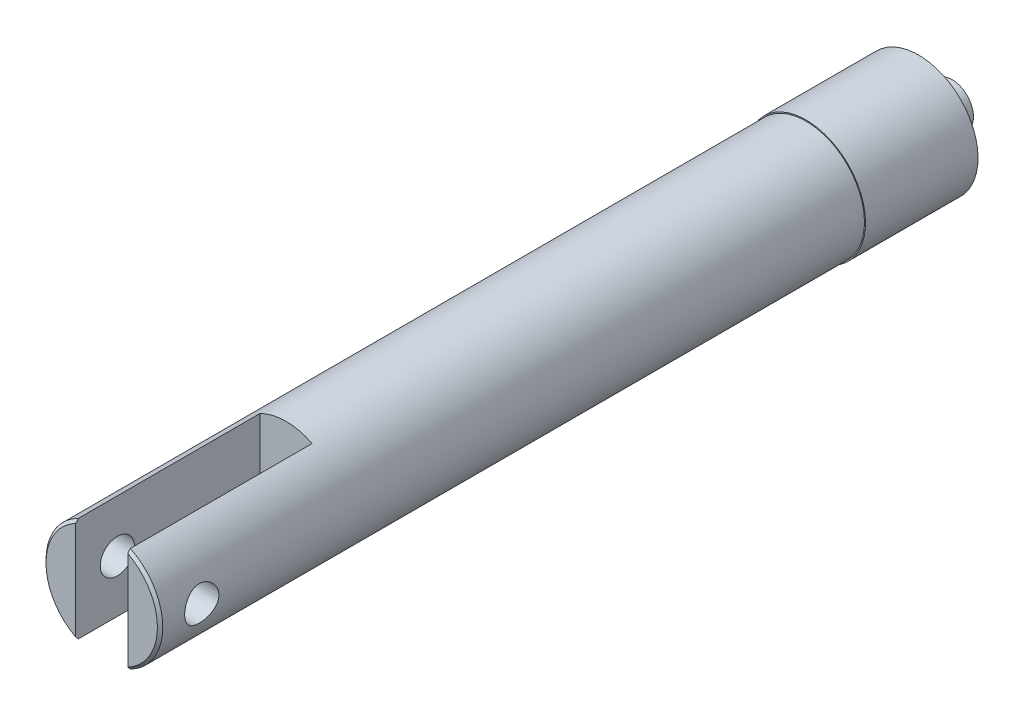
ISO-10303-21;
HEADER;
FILE_DESCRIPTION(('STEP AP214'),'2;1');
FILE_NAME('part.step','',(''),(''),'','','');
FILE_SCHEMA(('AUTOMOTIVE_DESIGN { 1 0 10303 214 1 1 1 1 }'));
ENDSEC;
DATA;
#1=APPLICATION_CONTEXT('core data for automotive mechanical design processes');
#2=APPLICATION_PROTOCOL_DEFINITION('international standard','automotive_design',2000,#1);
#3=PRODUCT_CONTEXT('',#1,'mechanical');
#4=PRODUCT('Part','Part','',(#3));
#5=PRODUCT_RELATED_PRODUCT_CATEGORY('part','',(#4));
#6=PRODUCT_DEFINITION_FORMATION('','',#4);
#7=PRODUCT_DEFINITION_CONTEXT('part definition',#1,'design');
#8=PRODUCT_DEFINITION('design','',#6,#7);
#9=PRODUCT_DEFINITION_SHAPE('','',#8);
#10=(LENGTH_UNIT() NAMED_UNIT(*) SI_UNIT(.MILLI.,.METRE.));
#11=(NAMED_UNIT(*) PLANE_ANGLE_UNIT() SI_UNIT($,.RADIAN.));
#12=(NAMED_UNIT(*) SI_UNIT($,.STERADIAN.) SOLID_ANGLE_UNIT());
#13=UNCERTAINTY_MEASURE_WITH_UNIT(LENGTH_MEASURE(1.E-05),#10,'distance_accuracy_value','');
#14=(GEOMETRIC_REPRESENTATION_CONTEXT(3) GLOBAL_UNCERTAINTY_ASSIGNED_CONTEXT((#13)) GLOBAL_UNIT_ASSIGNED_CONTEXT((#10,
#11,#12)) REPRESENTATION_CONTEXT('',''));
#15=CARTESIAN_POINT('',(0.,0.,0.));
#16=DIRECTION('',(0.,0.,1.));
#17=DIRECTION('',(1.,0.,0.));
#18=AXIS2_PLACEMENT_3D('',#15,#16,#17);
#19=CARTESIAN_POINT('',(0.,0.,29.3116));
#20=DIRECTION('',(0.,0.,-1.));
#21=DIRECTION('',(0.,1.,0.));
#22=AXIS2_PLACEMENT_3D('',#19,#20,#21);
#23=PLANE('',#22);
#24=DIRECTION('',(0.,-1.,0.));
#25=VECTOR('',#24,1.);
#26=CARTESIAN_POINT('',(-2.4765,5.5499,29.3116));
#27=LINE('',#26,#25);
#28=CARTESIAN_POINT('',(-2.4765,4.68118623427865,29.3116));
#29=VERTEX_POINT('',#28);
#30=CARTESIAN_POINT('',(-2.4765,-4.68118623427866,29.3116));
#31=VERTEX_POINT('',#30);
#32=EDGE_CURVE('E111',#29,#31,#27,.T.);
#33=ORIENTED_EDGE('',*,*,#32,.F.);
#34=CARTESIAN_POINT('',(0.,0.,29.3116));
#35=DIRECTION('',(0.,0.,1.));
#36=DIRECTION('',(0.,-1.,0.));
#37=AXIS2_PLACEMENT_3D('',#34,#35,#36);
#38=CIRCLE('',#37,5.2959);
#39=EDGE_CURVE('E200',#29,#31,#38,.T.);
#40=ORIENTED_EDGE('',*,*,#39,.T.);
#41=EDGE_LOOP('',(#33,#40));
#42=FACE_BOUND('',#41,.T.);
#43=ADVANCED_FACE('F35',(#42),#23,.F.);
#44=DIRECTION('',(0.,-1.,0.));
#45=VECTOR('',#44,1.);
#46=CARTESIAN_POINT('',(2.4765,5.5499,29.3116));
#47=LINE('',#46,#45);
#48=CARTESIAN_POINT('',(2.4765,4.68118623427865,29.3116));
#49=VERTEX_POINT('',#48);
#50=CARTESIAN_POINT('',(2.4765,-4.68118623427866,29.3116));
#51=VERTEX_POINT('',#50);
#52=EDGE_CURVE('E107',#49,#51,#47,.T.);
#53=ORIENTED_EDGE('',*,*,#52,.T.);
#54=EDGE_CURVE('E204',#51,#49,#38,.T.);
#55=ORIENTED_EDGE('',*,*,#54,.T.);
#56=EDGE_LOOP('',(#53,#55));
#57=FACE_BOUND('',#56,.T.);
#58=ADVANCED_FACE('F191',(#57),#23,.F.);
#59=CARTESIAN_POINT('',(0.,0.,29.0576));
#60=DIRECTION('',(0.,0.,-1.));
#61=DIRECTION('',(0.,1.,0.));
#62=AXIS2_PLACEMENT_3D('',#59,#60,#61);
#63=CONICAL_SURFACE('',#62,5.5499,0.785398163397448);
#64=CARTESIAN_POINT('',(-2.4765,11.9579738281488,22.3957765211174));
#65=CARTESIAN_POINT('',(-2.4765,11.6669516768995,22.6807379504089));
#66=CARTESIAN_POINT('',(-2.4765,11.3757282787579,22.9654943859405));
#67=CARTESIAN_POINT('',(-2.4765,10.7922540933097,23.5349364755889));
#68=CARTESIAN_POINT('',(-2.4765,10.5000024017493,23.8196212030231));
#69=CARTESIAN_POINT('',(-2.4765,9.90650352649077,24.3963861981994));
#70=CARTESIAN_POINT('',(-2.4765,9.60523692611629,24.6884464954769));
#71=CARTESIAN_POINT('',(-2.4765,9.00228537789054,25.2711102394173));
#72=CARTESIAN_POINT('',(-2.4765,8.70060200730528,25.5617153171939));
#73=CARTESIAN_POINT('',(-2.4765,8.11209652300594,26.1261907842555));
#74=CARTESIAN_POINT('',(-2.4765,7.82533866519259,26.400128122141));
#75=CARTESIAN_POINT('',(-2.4765,7.25026072461873,26.9464785770249));
#76=CARTESIAN_POINT('',(-2.4765,6.96194033428083,27.2188913707568));
#77=CARTESIAN_POINT('',(-2.4765,6.38119046188001,27.7633524723571));
#78=CARTESIAN_POINT('',(-2.4765,6.08874635093367,28.0353851921593));
#79=CARTESIAN_POINT('',(-2.4765,5.50099011407338,28.5758772463794));
#80=CARTESIAN_POINT('',(-2.4765,5.20568046970058,28.8443392653716));
#81=CARTESIAN_POINT('',(-2.4765,4.76315987763355,29.2393943792349));
#82=CARTESIAN_POINT('',(-2.4765,4.61778074117851,29.3680376470524));
#83=CARTESIAN_POINT('',(-2.4765,4.3255733961803,29.6236658089482));
#84=CARTESIAN_POINT('',(-2.4765,4.17874521488689,29.7506507341082));
#85=CARTESIAN_POINT('',(-2.4765,3.88275660050874,30.0028472478786));
#86=CARTESIAN_POINT('',(-2.4765,3.73359020362422,30.1280518538418));
#87=CARTESIAN_POINT('',(-2.4765,3.43283148005181,30.3754724529418));
#88=CARTESIAN_POINT('',(-2.4765,3.2812395877739,30.4976889715528));
#89=CARTESIAN_POINT('',(-2.4765,2.97686794303728,30.7363262900187));
#90=CARTESIAN_POINT('',(-2.4765,2.82413246110267,30.8528033423591));
#91=CARTESIAN_POINT('',(-2.4765,2.51420243017181,31.0800247091603));
#92=CARTESIAN_POINT('',(-2.4765,2.35700440076163,31.19076434756));
#93=CARTESIAN_POINT('',(-2.4765,2.11717726727405,31.3498965920427));
#94=CARTESIAN_POINT('',(-2.4765,2.03678129086018,31.401649953291));
#95=CARTESIAN_POINT('',(-2.4765,1.87426651639115,31.5023672426264));
#96=CARTESIAN_POINT('',(-2.4765,1.79214798128899,31.5513315922838));
#97=CARTESIAN_POINT('',(-2.4765,1.62603257042879,31.6456814294901));
#98=CARTESIAN_POINT('',(-2.4765,1.54203868904788,31.6910721623982));
#99=CARTESIAN_POINT('',(-2.4765,1.37180247112305,31.777391549933));
#100=CARTESIAN_POINT('',(-2.4765,1.28556115120854,31.8183221801186));
#101=CARTESIAN_POINT('',(-2.4765,1.16065385140699,31.8727172359465));
#102=CARTESIAN_POINT('',(-2.4765,1.12299179798917,31.8885003919733));
#103=CARTESIAN_POINT('',(-2.4765,1.04718754730382,31.9189227597439));
#104=CARTESIAN_POINT('',(-2.4765,1.00904514868885,31.9335614718907));
#105=CARTESIAN_POINT('',(-2.4765,0.932298661832612,31.9615677786896));
#106=CARTESIAN_POINT('',(-2.4765,0.893694617426716,31.9749354929667));
#107=CARTESIAN_POINT('',(-2.4765,0.816035573032734,32.0002757399932));
#108=CARTESIAN_POINT('',(-2.4765,0.776980600464427,32.0122483570889));
#109=CARTESIAN_POINT('',(-2.4765,0.66049053722621,32.0455027353079));
#110=CARTESIAN_POINT('',(-2.4765,0.582414930537375,32.0646084280714));
#111=CARTESIAN_POINT('',(-2.4765,0.42486511536397,32.0960051524822));
#112=CARTESIAN_POINT('',(-2.4765,0.345390467957431,32.1082940046992));
#113=CARTESIAN_POINT('',(-2.4765,0.184141528902734,32.125480118516));
#114=CARTESIAN_POINT('',(-2.4765,0.102351878225025,32.1302366239575));
#115=CARTESIAN_POINT('',(-2.4765,-0.0612701439947182,32.1315930066288));
#116=CARTESIAN_POINT('',(-2.4765,-0.143102494912401,32.1281953699553));
#117=CARTESIAN_POINT('',(-2.4765,-0.306261695222074,32.1134619809484));
#118=CARTESIAN_POINT('',(-2.4765,-0.387586560688786,32.1021046326579));
#119=CARTESIAN_POINT('',(-2.4765,-0.548892047976768,32.0721413387003));
#120=CARTESIAN_POINT('',(-2.4765,-0.628872168214943,32.0535327482943));
#121=CARTESIAN_POINT('',(-2.4765,-0.818603632855242,32.0013823902045));
#122=CARTESIAN_POINT('',(-2.4765,-0.927527399075539,31.9648448678084));
#123=CARTESIAN_POINT('',(-2.4765,-1.14169608127113,31.8822975735044));
#124=CARTESIAN_POINT('',(-2.4765,-1.24693873777164,31.8362820993481));
#125=CARTESIAN_POINT('',(-2.4765,-1.45461008685384,31.7368587442485));
#126=CARTESIAN_POINT('',(-2.4765,-1.55701805650607,31.6834080808766));
#127=CARTESIAN_POINT('',(-2.4765,-1.70834101067268,31.5992226294749));
#128=CARTESIAN_POINT('',(-2.4765,-1.75839420976593,31.5704965188583));
#129=CARTESIAN_POINT('',(-2.4765,-1.85780907482113,31.5118747467145));
#130=CARTESIAN_POINT('',(-2.4765,-1.90717077010375,31.4819791349806));
#131=CARTESIAN_POINT('',(-2.4765,-2.06969426299041,31.381242909254));
#132=CARTESIAN_POINT('',(-2.4765,-2.18149269372791,31.3082005127479));
#133=CARTESIAN_POINT('',(-2.4765,-2.40240413003915,31.1581463554024));
#134=CARTESIAN_POINT('',(-2.4765,-2.51151646114104,31.0811336123422));
#135=CARTESIAN_POINT('',(-2.4765,-2.72765615783911,30.9240717492863));
#136=CARTESIAN_POINT('',(-2.4765,-2.83468182747963,30.844020303506));
#137=CARTESIAN_POINT('',(-2.4765,-3.0469828645667,30.6816241610029));
#138=CARTESIAN_POINT('',(-2.4765,-3.15225811272229,30.5992793089995));
#139=CARTESIAN_POINT('',(-2.4765,-3.46652498439629,30.3491413614264));
#140=CARTESIAN_POINT('',(-2.4765,-3.67338304251804,30.1786712597172));
#141=CARTESIAN_POINT('',(-2.4765,-4.08315355653687,29.8332820215912));
#142=CARTESIAN_POINT('',(-2.4765,-4.28606776303578,29.6583649425436));
#143=CARTESIAN_POINT('',(-2.4765,-4.68981656840666,29.3048689419979));
#144=CARTESIAN_POINT('',(-2.4765,-4.89064250384476,29.1262801459341));
#145=CARTESIAN_POINT('',(-2.4765,-5.29032207131684,28.7668715648714));
#146=CARTESIAN_POINT('',(-2.4765,-5.48917548472361,28.5860515374466));
#147=CARTESIAN_POINT('',(-2.4765,-5.88506601239989,28.2230797461259));
#148=CARTESIAN_POINT('',(-2.4765,-6.0821055555888,28.0409306279334));
#149=CARTESIAN_POINT('',(-2.4765,-6.47503875401579,27.6753997260464));
#150=CARTESIAN_POINT('',(-2.4765,-6.67093240231825,27.4920179349055));
#151=CARTESIAN_POINT('',(-2.4765,-7.29802900851182,26.9021372423082));
#152=CARTESIAN_POINT('',(-2.4765,-7.72751652834494,26.4938156271734));
#153=CARTESIAN_POINT('',(-2.4765,-8.58407317998702,25.6741855738119));
#154=CARTESIAN_POINT('',(-2.4765,-9.01114086137836,25.2628756247995));
#155=CARTESIAN_POINT('',(-2.4765,-9.85895233955735,24.4428285151715));
#156=CARTESIAN_POINT('',(-2.4765,-10.2797149575069,24.0341108045201));
#157=CARTESIAN_POINT('',(-2.4765,-10.9098299234032,23.4202201761463));
#158=CARTESIAN_POINT('',(-2.4765,-11.1196367156543,23.2155131269927));
#159=CARTESIAN_POINT('',(-2.4765,-11.5389898687681,22.8058332649137));
#160=CARTESIAN_POINT('',(-2.4765,-11.7485362301486,22.6008604525185));
#161=CARTESIAN_POINT('',(-2.4765,-11.9579738281488,22.3957765211174));
#162=B_SPLINE_CURVE_WITH_KNOTS('',3,(#64,#65,#66,#67,#68,#69,#70,#71,#72,#73,#74,#75,#76,#77,
#78,#79,#80,#81,#82,#83,#84,#85,#86,#87,#88,#89,#90,#91,#92,#93,#94,#95,#96,#97,#98,#99,#100,
#101,#102,#103,#104,#105,#106,#107,#108,#109,#110,#111,#112,#113,#114,#115,#116,#117,#118,#119,
#120,#121,#122,#123,#124,#125,#126,#127,#128,#129,#130,#131,#132,#133,#134,#135,#136,#137,#138,
#139,#140,#141,#142,#143,#144,#145,#146,#147,#148,#149,#150,#151,#152,#153,#154,#155,#156,#157,
#158,#159,#160,#161),.UNSPECIFIED.,.F.,.F.,(4,2,2,2,2,2,2,2,2,2,2,2,2,2,2,2,2,2,2,2,2,2,2,2,2,2,
2,2,2,2,2,2,2,2,2,2,2,2,2,2,2,2,2,2,2,2,2,2,4),(0.,1.22191378573538,2.44588522501573,
3.7046715672028,4.96132197605525,6.15104296107095,7.34100732196848,8.53921226540252,
9.73645865747446,10.3188219836054,10.9011743789898,11.4853920232731,12.0695061792098,
12.6456678969772,13.2222920358278,13.5090897870932,13.7958440720429,14.0821692919997,
14.3683671669977,14.4908585076055,14.6134030255752,14.7359359983482,14.8584615590421,
15.0993147322068,15.3402448648668,15.5856262438034,15.8309328185054,16.0769075383521,
16.3229720564363,16.6670236189552,17.0112827820362,17.3576117554807,17.5307317508855,
17.7038443834218,18.1043455689445,18.5049463140632,18.905860113677,19.3068011244362,
20.1108286141899,20.9144906613942,21.7207079561374,22.5270136324517,23.332007317487,
24.1370058697903,25.9148096860511,27.6935853779615,29.4533602116242,30.3327432663626,
31.2121245697868),.UNSPECIFIED.);
#163=CARTESIAN_POINT('',(-2.4765,4.96672304039594,29.0576));
#164=VERTEX_POINT('',#163);
#165=EDGE_CURVE('E203',#164,#29,#162,.T.);
#166=ORIENTED_EDGE('',*,*,#165,.F.);
#167=CARTESIAN_POINT('',(0.,0.,29.0576));
#168=DIRECTION('',(0.,0.,1.));
#169=DIRECTION('',(0.,-1.,0.));
#170=AXIS2_PLACEMENT_3D('',#167,#168,#169);
#171=CIRCLE('',#170,5.5499);
#172=CARTESIAN_POINT('',(-2.4765,-4.96672304039595,29.0576));
#173=VERTEX_POINT('',#172);
#174=EDGE_CURVE('E208',#164,#173,#171,.T.);
#175=ORIENTED_EDGE('',*,*,#174,.T.);
#176=EDGE_CURVE('E57',#31,#173,#162,.T.);
#177=ORIENTED_EDGE('',*,*,#176,.F.);
#178=ORIENTED_EDGE('',*,*,#39,.F.);
#179=EDGE_LOOP('',(#166,#175,#177,#178));
#180=FACE_BOUND('',#179,.T.);
#181=ADVANCED_FACE('F131',(#180),#63,.T.);
#182=CARTESIAN_POINT('',(2.4765,-11.9579738281488,22.3957765211174));
#183=CARTESIAN_POINT('',(2.4765,-11.6669516768996,22.6807379504089));
#184=CARTESIAN_POINT('',(2.4765,-11.3757282787579,22.9654943859405));
#185=CARTESIAN_POINT('',(2.4765,-10.7922540933097,23.5349364755889));
#186=CARTESIAN_POINT('',(2.4765,-10.5000024017493,23.8196212030231));
#187=CARTESIAN_POINT('',(2.4765,-9.90650352649078,24.3963861981994));
#188=CARTESIAN_POINT('',(2.4765,-9.60523692611631,24.6884464954768));
#189=CARTESIAN_POINT('',(2.4765,-9.00228537789057,25.2711102394173));
#190=CARTESIAN_POINT('',(2.4765,-8.7006020073053,25.5617153171938));
#191=CARTESIAN_POINT('',(2.4765,-8.11209652300596,26.1261907842555));
#192=CARTESIAN_POINT('',(2.4765,-7.82533866519262,26.400128122141));
#193=CARTESIAN_POINT('',(2.4765,-7.25026072461875,26.9464785770249));
#194=CARTESIAN_POINT('',(2.4765,-6.96194033428086,27.2188913707568));
#195=CARTESIAN_POINT('',(2.4765,-6.38119046188003,27.7633524723571));
#196=CARTESIAN_POINT('',(2.4765,-6.08874635093369,28.0353851921593));
#197=CARTESIAN_POINT('',(2.4765,-5.5009901140734,28.5758772463793));
#198=CARTESIAN_POINT('',(2.4765,-5.20568046970059,28.8443392653716));
#199=CARTESIAN_POINT('',(2.4765,-4.76315987763356,29.2393943792349));
#200=CARTESIAN_POINT('',(2.4765,-4.61778074117853,29.3680376470524));
#201=CARTESIAN_POINT('',(2.4765,-4.32557339618031,29.6236658089482));
#202=CARTESIAN_POINT('',(2.4765,-4.17874521488691,29.7506507341082));
#203=CARTESIAN_POINT('',(2.4765,-3.88275660050875,30.0028472478786));
#204=CARTESIAN_POINT('',(2.4765,-3.73359020362423,30.1280518538418));
#205=CARTESIAN_POINT('',(2.4765,-3.43283148005182,30.3754724529418));
#206=CARTESIAN_POINT('',(2.4765,-3.28123958777391,30.4976889715528));
#207=CARTESIAN_POINT('',(2.4765,-2.97686794303729,30.7363262900187));
#208=CARTESIAN_POINT('',(2.4765,-2.82413246110268,30.8528033423591));
#209=CARTESIAN_POINT('',(2.4765,-2.51420243017182,31.0800247091603));
#210=CARTESIAN_POINT('',(2.4765,-2.35700440076164,31.19076434756));
#211=CARTESIAN_POINT('',(2.4765,-2.11717726727406,31.3498965920427));
#212=CARTESIAN_POINT('',(2.4765,-2.03678129086019,31.401649953291));
#213=CARTESIAN_POINT('',(2.4765,-1.87426651639116,31.5023672426264));
#214=CARTESIAN_POINT('',(2.4765,-1.792147981289,31.5513315922838));
#215=CARTESIAN_POINT('',(2.4765,-1.6260325704288,31.6456814294901));
#216=CARTESIAN_POINT('',(2.4765,-1.54203868904788,31.6910721623982));
#217=CARTESIAN_POINT('',(2.4765,-1.37180247112306,31.777391549933));
#218=CARTESIAN_POINT('',(2.4765,-1.28556115120854,31.8183221801186));
#219=CARTESIAN_POINT('',(2.4765,-1.160653851407,31.8727172359465));
#220=CARTESIAN_POINT('',(2.4765,-1.12299179798918,31.8885003919733));
#221=CARTESIAN_POINT('',(2.4765,-1.04718754730383,31.9189227597439));
#222=CARTESIAN_POINT('',(2.4765,-1.00904514868886,31.9335614718907));
#223=CARTESIAN_POINT('',(2.4765,-0.93229866183262,31.9615677786896));
#224=CARTESIAN_POINT('',(2.4765,-0.893694617426723,31.9749354929667));
#225=CARTESIAN_POINT('',(2.4765,-0.816035573032741,32.0002757399932));
#226=CARTESIAN_POINT('',(2.4765,-0.776980600464434,32.0122483570889));
#227=CARTESIAN_POINT('',(2.4765,-0.660490537226217,32.0455027353079));
#228=CARTESIAN_POINT('',(2.4765,-0.582414930537382,32.0646084280714));
#229=CARTESIAN_POINT('',(2.4765,-0.424865115363978,32.0960051524822));
#230=CARTESIAN_POINT('',(2.4765,-0.345390467957438,32.1082940046992));
#231=CARTESIAN_POINT('',(2.4765,-0.184141528902741,32.125480118516));
#232=CARTESIAN_POINT('',(2.4765,-0.102351878225032,32.1302366239575));
#233=CARTESIAN_POINT('',(2.4765,0.0612701439947103,32.1315930066288));
#234=CARTESIAN_POINT('',(2.4765,0.143102494912393,32.1281953699552));
#235=CARTESIAN_POINT('',(2.4765,0.306261695222067,32.1134619809484));
#236=CARTESIAN_POINT('',(2.4765,0.387586560688778,32.1021046326579));
#237=CARTESIAN_POINT('',(2.4765,0.54889204797676,32.0721413387003));
#238=CARTESIAN_POINT('',(2.4765,0.628872168214936,32.0535327482943));
#239=CARTESIAN_POINT('',(2.4765,0.818603632855233,32.0013823902045));
#240=CARTESIAN_POINT('',(2.4765,0.927527399075527,31.9648448678084));
#241=CARTESIAN_POINT('',(2.4765,1.14169608127112,31.8822975735044));
#242=CARTESIAN_POINT('',(2.4765,1.24693873777163,31.8362820993481));
#243=CARTESIAN_POINT('',(2.4765,1.45461008685383,31.7368587442485));
#244=CARTESIAN_POINT('',(2.4765,1.55701805650607,31.6834080808766));
#245=CARTESIAN_POINT('',(2.4765,1.70834101067267,31.5992226294749));
#246=CARTESIAN_POINT('',(2.4765,1.75839420976592,31.5704965188583));
#247=CARTESIAN_POINT('',(2.4765,1.85780907482112,31.5118747467145));
#248=CARTESIAN_POINT('',(2.4765,1.90717077010374,31.4819791349806));
#249=CARTESIAN_POINT('',(2.4765,2.06969426299041,31.381242909254));
#250=CARTESIAN_POINT('',(2.4765,2.18149269372791,31.3082005127479));
#251=CARTESIAN_POINT('',(2.4765,2.40240413003915,31.1581463554024));
#252=CARTESIAN_POINT('',(2.4765,2.51151646114103,31.0811336123422));
#253=CARTESIAN_POINT('',(2.4765,2.72765615783911,30.9240717492863));
#254=CARTESIAN_POINT('',(2.4765,2.83468182747963,30.844020303506));
#255=CARTESIAN_POINT('',(2.4765,3.0469828645667,30.6816241610029));
#256=CARTESIAN_POINT('',(2.4765,3.15225811272228,30.5992793089995));
#257=CARTESIAN_POINT('',(2.4765,3.46652498439629,30.3491413614264));
#258=CARTESIAN_POINT('',(2.4765,3.67338304251804,30.1786712597172));
#259=CARTESIAN_POINT('',(2.4765,4.08315355653687,29.8332820215912));
#260=CARTESIAN_POINT('',(2.4765,4.28606776303578,29.6583649425436));
#261=CARTESIAN_POINT('',(2.4765,4.68981656840666,29.3048689419979));
#262=CARTESIAN_POINT('',(2.4765,4.89064250384476,29.1262801459341));
#263=CARTESIAN_POINT('',(2.4765,5.29032207131684,28.7668715648714));
#264=CARTESIAN_POINT('',(2.4765,5.48917548472361,28.5860515374466));
#265=CARTESIAN_POINT('',(2.4765,5.8850660123999,28.2230797461259));
#266=CARTESIAN_POINT('',(2.4765,6.0821055555888,28.0409306279334));
#267=CARTESIAN_POINT('',(2.4765,6.4750387540158,27.6753997260464));
#268=CARTESIAN_POINT('',(2.4765,6.67093240231825,27.4920179349055));
#269=CARTESIAN_POINT('',(2.4765,7.29802900851182,26.9021372423082));
#270=CARTESIAN_POINT('',(2.4765,7.72751652834495,26.4938156271734));
#271=CARTESIAN_POINT('',(2.4765,8.58407317998702,25.6741855738118));
#272=CARTESIAN_POINT('',(2.4765,9.01114086137836,25.2628756247995));
#273=CARTESIAN_POINT('',(2.4765,9.85895233955735,24.4428285151715));
#274=CARTESIAN_POINT('',(2.4765,10.2797149575069,24.0341108045201));
#275=CARTESIAN_POINT('',(2.4765,10.9098299234032,23.4202201761463));
#276=CARTESIAN_POINT('',(2.4765,11.1196367156543,23.2155131269927));
#277=CARTESIAN_POINT('',(2.4765,11.5389898687681,22.8058332649137));
#278=CARTESIAN_POINT('',(2.4765,11.7485362301486,22.6008604525185));
#279=CARTESIAN_POINT('',(2.4765,11.9579738281488,22.3957765211174));
#280=B_SPLINE_CURVE_WITH_KNOTS('',3,(#182,#183,#184,#185,#186,#187,#188,#189,#190,#191,#192,
#193,#194,#195,#196,#197,#198,#199,#200,#201,#202,#203,#204,#205,#206,#207,#208,#209,#210,#211,
#212,#213,#214,#215,#216,#217,#218,#219,#220,#221,#222,#223,#224,#225,#226,#227,#228,#229,#230,
#231,#232,#233,#234,#235,#236,#237,#238,#239,#240,#241,#242,#243,#244,#245,#246,#247,#248,#249,
#250,#251,#252,#253,#254,#255,#256,#257,#258,#259,#260,#261,#262,#263,#264,#265,#266,#267,#268,
#269,#270,#271,#272,#273,#274,#275,#276,#277,#278,#279),.UNSPECIFIED.,.F.,.F.,(4,2,2,2,2,2,2,2,
2,2,2,2,2,2,2,2,2,2,2,2,2,2,2,2,2,2,2,2,2,2,2,2,2,2,2,2,2,2,2,2,2,2,2,2,2,2,2,2,4),(0.,
1.22191378573537,2.44588522501572,3.70467156720278,4.96132197605523,6.15104296107092,
7.34100732196846,8.5392122654025,9.73645865747445,10.3188219836054,10.9011743789898,
11.4853920232731,12.0695061792098,12.6456678969772,13.2222920358278,13.5090897870932,
13.7958440720429,14.0821692919997,14.3683671669977,14.4908585076055,14.6134030255752,
14.7359359983483,14.8584615590421,15.0993147322068,15.3402448648668,15.5856262438034,
15.8309328185054,16.0769075383521,16.3229720564363,16.6670236189552,17.0112827820362,
17.3576117554807,17.5307317508855,17.7038443834218,18.1043455689445,18.5049463140632,
18.905860113677,19.3068011244362,20.1108286141899,20.9144906613942,21.7207079561375,
22.5270136324518,23.332007317487,24.1370058697903,25.9148096860511,27.6935853779615,
29.4533602116242,30.3327432663627,31.2121245697868),.UNSPECIFIED.);
#281=CARTESIAN_POINT('',(2.4765,-4.96672304039595,29.0576));
#282=VERTEX_POINT('',#281);
#283=EDGE_CURVE('E124',#282,#51,#280,.T.);
#284=ORIENTED_EDGE('',*,*,#283,.F.);
#285=CARTESIAN_POINT('',(2.4765,4.96672304039594,29.0576));
#286=VERTEX_POINT('',#285);
#287=EDGE_CURVE('E205',#282,#286,#171,.T.);
#288=ORIENTED_EDGE('',*,*,#287,.T.);
#289=EDGE_CURVE('E105',#49,#286,#280,.T.);
#290=ORIENTED_EDGE('',*,*,#289,.F.);
#291=ORIENTED_EDGE('',*,*,#54,.F.);
#292=EDGE_LOOP('',(#284,#288,#290,#291));
#293=FACE_BOUND('',#292,.T.);
#294=ADVANCED_FACE('F165',(#293),#63,.T.);
#295=CARTESIAN_POINT('',(0.,0.,29.3116));
#296=DIRECTION('',(0.,0.,1.));
#297=DIRECTION('',(0.,-1.,0.));
#298=AXIS2_PLACEMENT_3D('',#295,#296,#297);
#299=CYLINDRICAL_SURFACE('',#298,5.54989999999999);
#300=CARTESIAN_POINT('',(-5.54989999999999,0.,23.7236));
#301=CARTESIAN_POINT('',(-5.54989907724446,0.0892755035356934,23.7236013366109));
#302=CARTESIAN_POINT('',(-5.54772514584038,0.178564598579979,23.7309787664117));
#303=CARTESIAN_POINT('',(-5.53926498675739,0.354548754643266,23.7602275075715));
#304=CARTESIAN_POINT('',(-5.53297736763345,0.44124292755625,23.7821037231427));
#305=CARTESIAN_POINT('',(-5.51697990977184,0.609473116793908,23.8395614415831));
#306=CARTESIAN_POINT('',(-5.50727498299406,0.691016339606443,23.8751232798328));
#307=CARTESIAN_POINT('',(-5.4854553353211,0.846982422213485,23.9588638222887));
#308=CARTESIAN_POINT('',(-5.47334032780879,0.921404433562518,24.0070440273409));
#309=CARTESIAN_POINT('',(-5.447623738627,1.06306206351374,24.1160503739585));
#310=CARTESIAN_POINT('',(-5.43399277761792,1.13007413479286,24.1771600796466));
#311=CARTESIAN_POINT('',(-5.40695871720613,1.25306050894608,24.3096860072907));
#312=CARTESIAN_POINT('',(-5.39355565431872,1.30903305794539,24.3811038638104));
#313=CARTESIAN_POINT('',(-5.36818646723952,1.4095084802972,24.5340864090737));
#314=CARTESIAN_POINT('',(-5.35625698087354,1.4537419990312,24.6158346474855));
#315=CARTESIAN_POINT('',(-5.3356231908575,1.52774394633379,24.7860149293263));
#316=CARTESIAN_POINT('',(-5.3269181535705,1.55751566577768,24.8744454468623));
#317=CARTESIAN_POINT('',(-5.31402441443637,1.60094937376303,25.0529770555034));
#318=CARTESIAN_POINT('',(-5.30972084078135,1.61502202923219,25.1429697242109));
#319=CARTESIAN_POINT('',(-5.30577522506576,1.62794009113206,25.3241336530228));
#320=CARTESIAN_POINT('',(-5.30613211258399,1.62678899417463,25.4153046376842));
#321=CARTESIAN_POINT('',(-5.31136506183246,1.60961554928479,25.5929283003343));
#322=CARTESIAN_POINT('',(-5.31608598981721,1.59410367279516,25.6794356534326));
#323=CARTESIAN_POINT('',(-5.32926468904175,1.54947215430466,25.8485621163824));
#324=CARTESIAN_POINT('',(-5.33772281350872,1.52035122600719,25.9311808578784));
#325=CARTESIAN_POINT('',(-5.35754944323353,1.44894354386055,26.0914515145175));
#326=CARTESIAN_POINT('',(-5.36895484387434,1.40648829613039,26.1690235994491));
#327=CARTESIAN_POINT('',(-5.39337272942498,1.30973430955867,26.3161153848713));
#328=CARTESIAN_POINT('',(-5.40638558770937,1.25543281686108,26.3856332072521));
#329=CARTESIAN_POINT('',(-5.43318503855367,1.13397587214191,26.5175433329357));
#330=CARTESIAN_POINT('',(-5.44698183679616,1.0663956318097,26.5795430829118));
#331=CARTESIAN_POINT('',(-5.47333553243088,0.921625644531362,26.6914184508191));
#332=CARTESIAN_POINT('',(-5.48589235885702,0.844435348153167,26.7412933750606));
#333=CARTESIAN_POINT('',(-5.50845703510734,0.681946511936177,26.8277267908149));
#334=CARTESIAN_POINT('',(-5.51844878775259,0.596601168856786,26.8642017779052));
#335=CARTESIAN_POINT('',(-5.53464153738588,0.420627572777451,26.9221663453222));
#336=CARTESIAN_POINT('',(-5.54084354037326,0.330000728769289,26.9436599027234));
#337=CARTESIAN_POINT('',(-5.54860041170824,0.14937671449739,26.9704062472826));
#338=CARTESIAN_POINT('',(-5.55030755347607,0.0594647975219507,26.9761914120506));
#339=CARTESIAN_POINT('',(-5.54932710557458,-0.120049253866679,26.9728440587747));
#340=CARTESIAN_POINT('',(-5.54664007260265,-0.209651426080247,26.9637134304106));
#341=CARTESIAN_POINT('',(-5.5372726201359,-0.384017379998919,26.9312256834306));
#342=CARTESIAN_POINT('',(-5.53067869809617,-0.46884362206552,26.9081765115788));
#343=CARTESIAN_POINT('',(-5.51425674885354,-0.633409078191009,26.84887358698));
#344=CARTESIAN_POINT('',(-5.50442833990401,-0.713147690461333,26.8126182755396));
#345=CARTESIAN_POINT('',(-5.48228553814936,-0.86725777205337,26.7270180513095));
#346=CARTESIAN_POINT('',(-5.46992038277833,-0.941468972634517,26.6773980779087));
#347=CARTESIAN_POINT('',(-5.44412636779364,-1.08069411948732,26.5668137514691));
#348=CARTESIAN_POINT('',(-5.43069725429657,-1.14570586019558,26.505846686058));
#349=CARTESIAN_POINT('',(-5.40370955417761,-1.2670092130063,26.371800125755));
#350=CARTESIAN_POINT('',(-5.39016248555801,-1.322922586817,26.2983753099357));
#351=CARTESIAN_POINT('',(-5.36496855466263,-1.42165686173055,26.1428916071624));
#352=CARTESIAN_POINT('',(-5.3533216337151,-1.46447816711899,26.060832986927));
#353=CARTESIAN_POINT('',(-5.33338212831179,-1.53550894747979,25.8907146501301));
#354=CARTESIAN_POINT('',(-5.32507279024849,-1.56379160744794,25.8026875666497));
#355=CARTESIAN_POINT('',(-5.31278245616318,-1.60505609960617,25.6228339179118));
#356=CARTESIAN_POINT('',(-5.308800064152,-1.61804286677638,25.5310085880017));
#357=CARTESIAN_POINT('',(-5.30574755389828,-1.62802231224556,25.3500811638763));
#358=CARTESIAN_POINT('',(-5.30648868365528,-1.62562952447749,25.2610156934586));
#359=CARTESIAN_POINT('',(-5.31234851911418,-1.6063755096074,25.0846168197822));
#360=CARTESIAN_POINT('',(-5.31746706450858,-1.58951481234178,24.9972833532147));
#361=CARTESIAN_POINT('',(-5.33138140938686,-1.54219182804677,24.8277805846974));
#362=CARTESIAN_POINT('',(-5.3401350972468,-1.51188504194761,24.7455641592093));
#363=CARTESIAN_POINT('',(-5.36032744257694,-1.43865075303401,24.5873176373947));
#364=CARTESIAN_POINT('',(-5.37176659486979,-1.39572092393393,24.5112886846505));
#365=CARTESIAN_POINT('',(-5.39653949353948,-1.29670299971405,24.3647051995735));
#366=CARTESIAN_POINT('',(-5.40992543962596,-1.24020786458484,24.2944344404681));
#367=CARTESIAN_POINT('',(-5.436822312107,-1.11640479915404,24.1641713291863));
#368=CARTESIAN_POINT('',(-5.45033326958017,-1.04909410804624,24.1041816094757));
#369=CARTESIAN_POINT('',(-5.47640171115957,-0.903346998093417,23.9945489602031));
#370=CARTESIAN_POINT('',(-5.48892290208423,-0.82465616083069,23.9452347679671));
#371=CARTESIAN_POINT('',(-5.51117470083009,-0.659733541919419,23.8606077721015));
#372=CARTESIAN_POINT('',(-5.52090672456865,-0.573505615581995,23.8252878607966));
#373=CARTESIAN_POINT('',(-5.53554159653088,-0.406607676404475,23.7731441030581));
#374=CARTESIAN_POINT('',(-5.54088270864287,-0.326505770576913,23.7546137388842));
#375=CARTESIAN_POINT('',(-5.5480620726446,-0.16427287480861,23.7298419924793));
#376=CARTESIAN_POINT('',(-5.54990084902529,-0.0821421905531775,23.7235987701873));
#377=CARTESIAN_POINT('',(-5.54989999999999,0.,23.7236));
#378=B_SPLINE_CURVE_WITH_KNOTS('',3,(#300,#301,#302,#303,#304,#305,#306,#307,#308,#309,#310,
#311,#312,#313,#314,#315,#316,#317,#318,#319,#320,#321,#322,#323,#324,#325,#326,#327,#328,#329,
#330,#331,#332,#333,#334,#335,#336,#337,#338,#339,#340,#341,#342,#343,#344,#345,#346,#347,#348,
#349,#350,#351,#352,#353,#354,#355,#356,#357,#358,#359,#360,#361,#362,#363,#364,#365,#366,#367,
#368,#369,#370,#371,#372,#373,#374,#375,#376,#377),.UNSPECIFIED.,.T.,.F.,(4,2,2,2,2,2,2,2,2,2,2,
2,2,2,2,2,2,2,2,2,2,2,2,2,2,2,2,2,2,2,2,2,2,2,2,2,2,2,4),(0.,0.267524894024951,
0.535140324521176,0.802372650462127,1.06963677583499,1.34351804773345,1.61744279680396,
1.89719534749838,2.1768842088467,2.44907144661051,2.72119616913071,2.98400461004568,
3.24683789604154,3.51313589642218,3.77949586827923,4.05643251894111,4.33338501007359,
4.61203523081333,4.89061145092611,5.15962107066189,5.42859661224727,5.69182861968128,
5.9550917059207,6.22425291871496,6.4934785537626,6.77199275109868,7.05049834699399,
7.32758791720903,7.60458806430623,7.8705906221093,8.13658343891815,8.39957719472723,
8.66261944775291,8.93484460609823,9.20713936404279,9.48689894034203,9.76651624444682,
10.0127021697455,10.2588512246644),.UNSPECIFIED.);
#379=CARTESIAN_POINT('',(-5.54989999999999,0.,23.7236));
#380=VERTEX_POINT('',#379);
#381=EDGE_CURVE('E113',#380,#380,#378,.T.);
#382=ORIENTED_EDGE('',*,*,#381,.T.);
#383=EDGE_LOOP('',(#382));
#384=FACE_BOUND('',#383,.T.);
#385=CARTESIAN_POINT('',(5.54989999999999,0.,23.7236));
#386=CARTESIAN_POINT('',(5.54989907724446,-0.0892755035356933,23.7236013366109));
#387=CARTESIAN_POINT('',(5.54772514584038,-0.178564598579979,23.7309787664117));
#388=CARTESIAN_POINT('',(5.53926498675739,-0.354548754643266,23.7602275075715));
#389=CARTESIAN_POINT('',(5.53297736763345,-0.44124292755625,23.7821037231427));
#390=CARTESIAN_POINT('',(5.51697990977184,-0.609473116793908,23.8395614415831));
#391=CARTESIAN_POINT('',(5.50727498299406,-0.691016339606443,23.8751232798328));
#392=CARTESIAN_POINT('',(5.4854553353211,-0.846982422213485,23.9588638222887));
#393=CARTESIAN_POINT('',(5.4733403278088,-0.921404433562518,24.0070440273409));
#394=CARTESIAN_POINT('',(5.447623738627,-1.06306206351374,24.1160503739585));
#395=CARTESIAN_POINT('',(5.43399277761792,-1.13007413479286,24.1771600796466));
#396=CARTESIAN_POINT('',(5.40695871720613,-1.25306050894608,24.3096860072907));
#397=CARTESIAN_POINT('',(5.39355565431872,-1.30903305794539,24.3811038638104));
#398=CARTESIAN_POINT('',(5.36818646723952,-1.4095084802972,24.5340864090737));
#399=CARTESIAN_POINT('',(5.35625698087354,-1.4537419990312,24.6158346474855));
#400=CARTESIAN_POINT('',(5.3356231908575,-1.52774394633378,24.7860149293263));
#401=CARTESIAN_POINT('',(5.32691815357051,-1.55751566577768,24.8744454468623));
#402=CARTESIAN_POINT('',(5.31402441443637,-1.60094937376303,25.0529770555034));
#403=CARTESIAN_POINT('',(5.30972084078135,-1.61502202923219,25.1429697242109));
#404=CARTESIAN_POINT('',(5.30577522506576,-1.62794009113206,25.3241336530228));
#405=CARTESIAN_POINT('',(5.30613211258399,-1.62678899417463,25.4153046376842));
#406=CARTESIAN_POINT('',(5.31136506183246,-1.60961554928479,25.5929283003343));
#407=CARTESIAN_POINT('',(5.31608598981722,-1.59410367279516,25.6794356534326));
#408=CARTESIAN_POINT('',(5.32926468904176,-1.54947215430466,25.8485621163824));
#409=CARTESIAN_POINT('',(5.33772281350872,-1.52035122600719,25.9311808578784));
#410=CARTESIAN_POINT('',(5.35754944323354,-1.44894354386055,26.0914515145175));
#411=CARTESIAN_POINT('',(5.36895484387435,-1.40648829613039,26.1690235994491));
#412=CARTESIAN_POINT('',(5.39337272942498,-1.30973430955867,26.3161153848713));
#413=CARTESIAN_POINT('',(5.40638558770938,-1.25543281686108,26.3856332072521));
#414=CARTESIAN_POINT('',(5.43318503855367,-1.13397587214191,26.5175433329357));
#415=CARTESIAN_POINT('',(5.44698183679616,-1.0663956318097,26.5795430829118));
#416=CARTESIAN_POINT('',(5.47333553243088,-0.921625644531362,26.6914184508191));
#417=CARTESIAN_POINT('',(5.48589235885702,-0.844435348153167,26.7412933750606));
#418=CARTESIAN_POINT('',(5.50845703510735,-0.681946511936178,26.8277267908149));
#419=CARTESIAN_POINT('',(5.51844878775259,-0.596601168856787,26.8642017779052));
#420=CARTESIAN_POINT('',(5.53464153738588,-0.420627572777452,26.9221663453222));
#421=CARTESIAN_POINT('',(5.54084354037326,-0.33000072876929,26.9436599027234));
#422=CARTESIAN_POINT('',(5.54860041170824,-0.149376714497389,26.9704062472826));
#423=CARTESIAN_POINT('',(5.55030755347607,-0.05946479752195,26.9761914120506));
#424=CARTESIAN_POINT('',(5.54932710557458,0.12004925386668,26.9728440587747));
#425=CARTESIAN_POINT('',(5.54664007260265,0.209651426080247,26.9637134304106));
#426=CARTESIAN_POINT('',(5.5372726201359,0.384017379998919,26.9312256834306));
#427=CARTESIAN_POINT('',(5.53067869809617,0.46884362206552,26.9081765115788));
#428=CARTESIAN_POINT('',(5.51425674885354,0.633409078191008,26.84887358698));
#429=CARTESIAN_POINT('',(5.50442833990401,0.713147690461333,26.8126182755396));
#430=CARTESIAN_POINT('',(5.48228553814936,0.867257772053369,26.7270180513095));
#431=CARTESIAN_POINT('',(5.46992038277833,0.941468972634515,26.6773980779087));
#432=CARTESIAN_POINT('',(5.44412636779364,1.08069411948732,26.5668137514691));
#433=CARTESIAN_POINT('',(5.43069725429657,1.14570586019558,26.505846686058));
#434=CARTESIAN_POINT('',(5.40370955417761,1.2670092130063,26.371800125755));
#435=CARTESIAN_POINT('',(5.39016248555801,1.322922586817,26.2983753099357));
#436=CARTESIAN_POINT('',(5.36496855466263,1.42165686173055,26.1428916071624));
#437=CARTESIAN_POINT('',(5.3533216337151,1.46447816711899,26.060832986927));
#438=CARTESIAN_POINT('',(5.33338212831179,1.53550894747979,25.8907146501301));
#439=CARTESIAN_POINT('',(5.32507279024848,1.56379160744794,25.8026875666497));
#440=CARTESIAN_POINT('',(5.31278245616318,1.60505609960617,25.6228339179118));
#441=CARTESIAN_POINT('',(5.308800064152,1.61804286677638,25.5310085880017));
#442=CARTESIAN_POINT('',(5.30574755389827,1.62802231224556,25.3500811638763));
#443=CARTESIAN_POINT('',(5.30648868365528,1.62562952447749,25.2610156934586));
#444=CARTESIAN_POINT('',(5.31234851911418,1.6063755096074,25.0846168197822));
#445=CARTESIAN_POINT('',(5.31746706450858,1.58951481234178,24.9972833532147));
#446=CARTESIAN_POINT('',(5.33138140938685,1.54219182804677,24.8277805846974));
#447=CARTESIAN_POINT('',(5.3401350972468,1.51188504194761,24.7455641592093));
#448=CARTESIAN_POINT('',(5.36032744257694,1.43865075303401,24.5873176373947));
#449=CARTESIAN_POINT('',(5.37176659486979,1.39572092393393,24.5112886846505));
#450=CARTESIAN_POINT('',(5.39653949353948,1.29670299971405,24.3647051995735));
#451=CARTESIAN_POINT('',(5.40992543962596,1.24020786458484,24.2944344404681));
#452=CARTESIAN_POINT('',(5.436822312107,1.11640479915404,24.1641713291863));
#453=CARTESIAN_POINT('',(5.45033326958017,1.04909410804624,24.1041816094757));
#454=CARTESIAN_POINT('',(5.47640171115957,0.903346998093417,23.9945489602031));
#455=CARTESIAN_POINT('',(5.48892290208423,0.824656160830689,23.9452347679671));
#456=CARTESIAN_POINT('',(5.51117470083009,0.659733541919418,23.8606077721015));
#457=CARTESIAN_POINT('',(5.52090672456865,0.573505615581994,23.8252878607966));
#458=CARTESIAN_POINT('',(5.53554159653088,0.406607676404475,23.7731441030581));
#459=CARTESIAN_POINT('',(5.54088270864287,0.326505770576912,23.7546137388842));
#460=CARTESIAN_POINT('',(5.5480620726446,0.164272874808609,23.7298419924793));
#461=CARTESIAN_POINT('',(5.54990084902529,0.082142190553177,23.7235987701873));
#462=CARTESIAN_POINT('',(5.54989999999999,0.,23.7236));
#463=B_SPLINE_CURVE_WITH_KNOTS('',3,(#385,#386,#387,#388,#389,#390,#391,#392,#393,#394,#395,
#396,#397,#398,#399,#400,#401,#402,#403,#404,#405,#406,#407,#408,#409,#410,#411,#412,#413,#414,
#415,#416,#417,#418,#419,#420,#421,#422,#423,#424,#425,#426,#427,#428,#429,#430,#431,#432,#433,
#434,#435,#436,#437,#438,#439,#440,#441,#442,#443,#444,#445,#446,#447,#448,#449,#450,#451,#452,
#453,#454,#455,#456,#457,#458,#459,#460,#461,#462),.UNSPECIFIED.,.T.,.F.,(4,2,2,2,2,2,2,2,2,2,2,
2,2,2,2,2,2,2,2,2,2,2,2,2,2,2,2,2,2,2,2,2,2,2,2,2,2,2,4),(0.,0.267524894024951,
0.535140324521176,0.802372650462127,1.06963677583499,1.34351804773345,1.61744279680396,
1.89719534749838,2.1768842088467,2.44907144661051,2.72119616913071,2.98400461004568,
3.24683789604154,3.51313589642218,3.77949586827923,4.05643251894111,4.33338501007359,
4.61203523081333,4.89061145092611,5.15962107066189,5.42859661224727,5.69182861968127,
5.9550917059207,6.22425291871495,6.4934785537626,6.77199275109868,7.05049834699399,
7.32758791720903,7.60458806430622,7.87059062210929,8.13658343891815,8.39957719472723,
8.66261944775291,8.93484460609823,9.20713936404279,9.48689894034203,9.76651624444682,
10.0127021697455,10.2588512246644),.UNSPECIFIED.);
#464=CARTESIAN_POINT('',(5.54989999999999,0.,23.7236));
#465=VERTEX_POINT('',#464);
#466=EDGE_CURVE('E169',#465,#465,#463,.T.);
#467=ORIENTED_EDGE('',*,*,#466,.T.);
#468=EDGE_LOOP('',(#467));
#469=FACE_BOUND('',#468,.T.);
#470=CARTESIAN_POINT('',(0.,0.,-37.6428));
#471=DIRECTION('',(0.,0.,1.));
#472=DIRECTION('',(0.,-1.,0.));
#473=AXIS2_PLACEMENT_3D('',#470,#471,#472);
#474=CIRCLE('',#473,5.54989999999999);
#475=CARTESIAN_POINT('',(0.,-5.54989999999999,-37.6428));
#476=VERTEX_POINT('',#475);
#477=EDGE_CURVE('E214',#476,#476,#474,.T.);
#478=ORIENTED_EDGE('',*,*,#477,.T.);
#479=EDGE_LOOP('',(#478));
#480=FACE_BOUND('',#479,.T.);
#481=DIRECTION('',(0.,0.,1.));
#482=VECTOR('',#481,1.);
#483=CARTESIAN_POINT('',(2.4765,4.96672304039594,29.3116));
#484=LINE('',#483,#482);
#485=CARTESIAN_POINT('',(2.4765,4.96672304039594,11.7856));
#486=VERTEX_POINT('',#485);
#487=EDGE_CURVE('E11',#286,#486,#484,.F.);
#488=ORIENTED_EDGE('',*,*,#487,.F.);
#489=ORIENTED_EDGE('',*,*,#287,.F.);
#490=DIRECTION('',(0.,0.,1.));
#491=VECTOR('',#490,1.);
#492=CARTESIAN_POINT('',(2.4765,-4.96672304039595,29.3116));
#493=LINE('',#492,#491);
#494=CARTESIAN_POINT('',(2.4765,-4.96672304039595,11.7856));
#495=VERTEX_POINT('',#494);
#496=EDGE_CURVE('E96',#495,#282,#493,.T.);
#497=ORIENTED_EDGE('',*,*,#496,.F.);
#498=CARTESIAN_POINT('',(0.,0.,11.7856));
#499=DIRECTION('',(0.,0.,1.));
#500=DIRECTION('',(1.,0.,0.));
#501=AXIS2_PLACEMENT_3D('',#498,#499,#500);
#502=CIRCLE('',#501,5.54989999999999);
#503=CARTESIAN_POINT('',(-2.4765,-4.96672304039595,11.7856));
#504=VERTEX_POINT('',#503);
#505=EDGE_CURVE('E98',#504,#495,#502,.T.);
#506=ORIENTED_EDGE('',*,*,#505,.F.);
#507=DIRECTION('',(0.,0.,1.));
#508=VECTOR('',#507,1.);
#509=CARTESIAN_POINT('',(-2.4765,-4.96672304039595,29.3116));
#510=LINE('',#509,#508);
#511=EDGE_CURVE('E43',#173,#504,#510,.F.);
#512=ORIENTED_EDGE('',*,*,#511,.F.);
#513=ORIENTED_EDGE('',*,*,#174,.F.);
#514=DIRECTION('',(0.,0.,1.));
#515=VECTOR('',#514,1.);
#516=CARTESIAN_POINT('',(-2.4765,4.96672304039594,29.3116));
#517=LINE('',#516,#515);
#518=CARTESIAN_POINT('',(-2.4765,4.96672304039594,11.7856));
#519=VERTEX_POINT('',#518);
#520=EDGE_CURVE('E50',#519,#164,#517,.T.);
#521=ORIENTED_EDGE('',*,*,#520,.F.);
#522=EDGE_CURVE('E88',#486,#519,#502,.T.);
#523=ORIENTED_EDGE('',*,*,#522,.F.);
#524=EDGE_LOOP('',(#488,#489,#497,#506,#512,#513,#521,#523));
#525=FACE_BOUND('',#524,.T.);
#526=ADVANCED_FACE('F89',(#384,#469,#480,#525),#299,.T.);
#527=CARTESIAN_POINT('',(0.,-5.54989999999999,-37.6428));
#528=DIRECTION('',(0.,0.,-1.));
#529=DIRECTION('',(0.,1.,0.));
#530=AXIS2_PLACEMENT_3D('',#527,#528,#529);
#531=PLANE('',#530);
#532=ORIENTED_EDGE('',*,*,#477,.F.);
#533=EDGE_LOOP('',(#532));
#534=FACE_BOUND('',#533,.T.);
#535=CARTESIAN_POINT('',(0.,0.,-37.6428));
#536=DIRECTION('',(0.,0.,1.));
#537=DIRECTION('',(0.,-1.,0.));
#538=AXIS2_PLACEMENT_3D('',#535,#536,#537);
#539=CIRCLE('',#538,5.6515);
#540=CARTESIAN_POINT('',(0.,-5.6515,-37.6428));
#541=VERTEX_POINT('',#540);
#542=EDGE_CURVE('E216',#541,#541,#539,.T.);
#543=ORIENTED_EDGE('',*,*,#542,.T.);
#544=EDGE_LOOP('',(#543));
#545=FACE_BOUND('',#544,.T.);
#546=ADVANCED_FACE('F159',(#534,#545),#531,.F.);
#547=CARTESIAN_POINT('',(0.,0.,29.3116));
#548=DIRECTION('',(0.,0.,1.));
#549=DIRECTION('',(0.,-1.,0.));
#550=AXIS2_PLACEMENT_3D('',#547,#548,#549);
#551=CYLINDRICAL_SURFACE('',#550,5.6515);
#552=ORIENTED_EDGE('',*,*,#542,.F.);
#553=EDGE_LOOP('',(#552));
#554=FACE_BOUND('',#553,.T.);
#555=CARTESIAN_POINT('',(0.,0.,-48.3362));
#556=DIRECTION('',(0.,0.,1.));
#557=DIRECTION('',(0.,-1.,0.));
#558=AXIS2_PLACEMENT_3D('',#555,#556,#557);
#559=CIRCLE('',#558,5.6515);
#560=CARTESIAN_POINT('',(0.,-5.6515,-48.3362));
#561=VERTEX_POINT('',#560);
#562=EDGE_CURVE('E220',#561,#561,#559,.T.);
#563=ORIENTED_EDGE('',*,*,#562,.T.);
#564=EDGE_LOOP('',(#563));
#565=FACE_BOUND('',#564,.T.);
#566=ADVANCED_FACE('F155',(#554,#565),#551,.T.);
#567=CARTESIAN_POINT('',(0.,-5.6515,-48.3362));
#568=DIRECTION('',(0.,0.,1.));
#569=DIRECTION('',(0.,-1.,0.));
#570=AXIS2_PLACEMENT_3D('',#567,#568,#569);
#571=PLANE('',#570);
#572=ORIENTED_EDGE('',*,*,#562,.F.);
#573=EDGE_LOOP('',(#572));
#574=FACE_BOUND('',#573,.T.);
#575=CARTESIAN_POINT('',(0.,0.,-48.3362));
#576=DIRECTION('',(0.,0.,1.));
#577=DIRECTION('',(0.,-1.,0.));
#578=AXIS2_PLACEMENT_3D('',#575,#576,#577);
#579=CIRCLE('',#578,2.0447);
#580=CARTESIAN_POINT('',(0.,-2.0447,-48.3362));
#581=VERTEX_POINT('',#580);
#582=EDGE_CURVE('E225',#581,#581,#579,.T.);
#583=ORIENTED_EDGE('',*,*,#582,.T.);
#584=EDGE_LOOP('',(#583));
#585=FACE_BOUND('',#584,.T.);
#586=ADVANCED_FACE('F151',(#574,#585),#571,.F.);
#587=CARTESIAN_POINT('',(0.,0.,29.3116));
#588=DIRECTION('',(0.,0.,1.));
#589=DIRECTION('',(0.,-1.,0.));
#590=AXIS2_PLACEMENT_3D('',#587,#588,#589);
#591=CYLINDRICAL_SURFACE('',#590,2.0447);
#592=ORIENTED_EDGE('',*,*,#582,.F.);
#593=EDGE_LOOP('',(#592));
#594=FACE_BOUND('',#593,.T.);
#595=CARTESIAN_POINT('',(0.,0.,-51.5112));
#596=DIRECTION('',(0.,0.,1.));
#597=DIRECTION('',(0.,-1.,0.));
#598=AXIS2_PLACEMENT_3D('',#595,#596,#597);
#599=CIRCLE('',#598,2.0447);
#600=CARTESIAN_POINT('',(0.,-2.0447,-51.5112));
#601=VERTEX_POINT('',#600);
#602=EDGE_CURVE('E227',#601,#601,#599,.T.);
#603=ORIENTED_EDGE('',*,*,#602,.T.);
#604=EDGE_LOOP('',(#603));
#605=FACE_BOUND('',#604,.T.);
#606=ADVANCED_FACE('F147',(#594,#605),#591,.T.);
#607=CARTESIAN_POINT('',(0.,-2.0447,-51.5112));
#608=DIRECTION('',(0.,0.,1.));
#609=DIRECTION('',(0.,-1.,0.));
#610=AXIS2_PLACEMENT_3D('',#607,#608,#609);
#611=PLANE('',#610);
#612=ORIENTED_EDGE('',*,*,#602,.F.);
#613=EDGE_LOOP('',(#612));
#614=FACE_BOUND('',#613,.T.);
#615=ADVANCED_FACE('F143',(#614),#611,.F.);
#616=CARTESIAN_POINT('',(-2.4765,5.5499,29.3116));
#617=DIRECTION('',(1.,0.,0.));
#618=DIRECTION('',(0.,0.,-1.));
#619=AXIS2_PLACEMENT_3D('',#616,#617,#618);
#620=PLANE('',#619);
#621=CARTESIAN_POINT('',(-2.4765,0.,25.3492));
#622=DIRECTION('',(1.,0.,0.));
#623=DIRECTION('',(0.,0.,-1.));
#624=AXIS2_PLACEMENT_3D('',#621,#622,#623);
#625=CIRCLE('',#624,1.6256);
#626=CARTESIAN_POINT('',(-2.4765,0.,23.7236));
#627=VERTEX_POINT('',#626);
#628=EDGE_CURVE('E330',#627,#627,#625,.T.);
#629=ORIENTED_EDGE('',*,*,#628,.F.);
#630=EDGE_LOOP('',(#629));
#631=FACE_BOUND('',#630,.T.);
#632=ORIENTED_EDGE('',*,*,#165,.T.);
#633=ORIENTED_EDGE('',*,*,#32,.T.);
#634=ORIENTED_EDGE('',*,*,#176,.T.);
#635=ORIENTED_EDGE('',*,*,#511,.T.);
#636=DIRECTION('',(0.,-1.,0.));
#637=VECTOR('',#636,1.);
#638=CARTESIAN_POINT('',(-2.4765,5.5499,11.7856));
#639=LINE('',#638,#637);
#640=EDGE_CURVE('E108',#519,#504,#639,.T.);
#641=ORIENTED_EDGE('',*,*,#640,.F.);
#642=ORIENTED_EDGE('',*,*,#520,.T.);
#643=EDGE_LOOP('',(#632,#633,#634,#635,#641,#642));
#644=FACE_BOUND('',#643,.T.);
#645=ADVANCED_FACE('F137',(#631,#644),#620,.T.);
#646=CARTESIAN_POINT('',(2.4765,5.5499,29.3116));
#647=DIRECTION('',(-1.,0.,0.));
#648=DIRECTION('',(0.,0.,1.));
#649=AXIS2_PLACEMENT_3D('',#646,#647,#648);
#650=PLANE('',#649);
#651=CARTESIAN_POINT('',(2.4765,0.,25.3492));
#652=DIRECTION('',(-1.,0.,0.));
#653=DIRECTION('',(0.,0.,1.));
#654=AXIS2_PLACEMENT_3D('',#651,#652,#653);
#655=CIRCLE('',#654,1.6256);
#656=CARTESIAN_POINT('',(2.4765,0.,26.9748));
#657=VERTEX_POINT('',#656);
#658=EDGE_CURVE('E38',#657,#657,#655,.T.);
#659=ORIENTED_EDGE('',*,*,#658,.F.);
#660=EDGE_LOOP('',(#659));
#661=FACE_BOUND('',#660,.T.);
#662=ORIENTED_EDGE('',*,*,#283,.T.);
#663=ORIENTED_EDGE('',*,*,#52,.F.);
#664=ORIENTED_EDGE('',*,*,#289,.T.);
#665=ORIENTED_EDGE('',*,*,#487,.T.);
#666=DIRECTION('',(0.,-1.,0.));
#667=VECTOR('',#666,1.);
#668=CARTESIAN_POINT('',(2.4765,5.5499,11.7856));
#669=LINE('',#668,#667);
#670=EDGE_CURVE('E102',#486,#495,#669,.T.);
#671=ORIENTED_EDGE('',*,*,#670,.T.);
#672=ORIENTED_EDGE('',*,*,#496,.T.);
#673=EDGE_LOOP('',(#662,#663,#664,#665,#671,#672));
#674=FACE_BOUND('',#673,.T.);
#675=ADVANCED_FACE('F101',(#661,#674),#650,.T.);
#676=CARTESIAN_POINT('',(-2.4765,5.5499,11.7856));
#677=DIRECTION('',(0.,0.,1.));
#678=DIRECTION('',(1.,0.,0.));
#679=AXIS2_PLACEMENT_3D('',#676,#677,#678);
#680=PLANE('',#679);
#681=ORIENTED_EDGE('',*,*,#670,.F.);
#682=ORIENTED_EDGE('',*,*,#522,.T.);
#683=ORIENTED_EDGE('',*,*,#640,.T.);
#684=ORIENTED_EDGE('',*,*,#505,.T.);
#685=EDGE_LOOP('',(#681,#682,#683,#684));
#686=FACE_BOUND('',#685,.T.);
#687=ADVANCED_FACE('F106',(#686),#680,.T.);
#688=CARTESIAN_POINT('',(-5.6515,0.,25.3492));
#689=DIRECTION('',(1.,0.,0.));
#690=DIRECTION('',(0.,0.,-1.));
#691=AXIS2_PLACEMENT_3D('',#688,#689,#690);
#692=CYLINDRICAL_SURFACE('',#691,1.6256);
#693=ORIENTED_EDGE('',*,*,#658,.T.);
#694=EDGE_LOOP('',(#693));
#695=FACE_BOUND('',#694,.T.);
#696=ORIENTED_EDGE('',*,*,#466,.F.);
#697=EDGE_LOOP('',(#696));
#698=FACE_BOUND('',#697,.T.);
#699=ADVANCED_FACE('F181',(#695,#698),#692,.F.);
#700=ORIENTED_EDGE('',*,*,#628,.T.);
#701=EDGE_LOOP('',(#700));
#702=FACE_BOUND('',#701,.T.);
#703=ORIENTED_EDGE('',*,*,#381,.F.);
#704=EDGE_LOOP('',(#703));
#705=FACE_BOUND('',#704,.T.);
#706=ADVANCED_FACE('F178',(#702,#705),#692,.F.);
#707=CLOSED_SHELL('',(#43,#58,#181,#294,#526,#546,#566,#586,#606,#615,#645,#675,#687,#699,#706));
#708=MANIFOLD_SOLID_BREP('B2',#707);
#709=ADVANCED_BREP_SHAPE_REPRESENTATION('',(#18,#708),#14);
#710=SHAPE_DEFINITION_REPRESENTATION(#9,#709);
ENDSEC;
END-ISO-10303-21;
